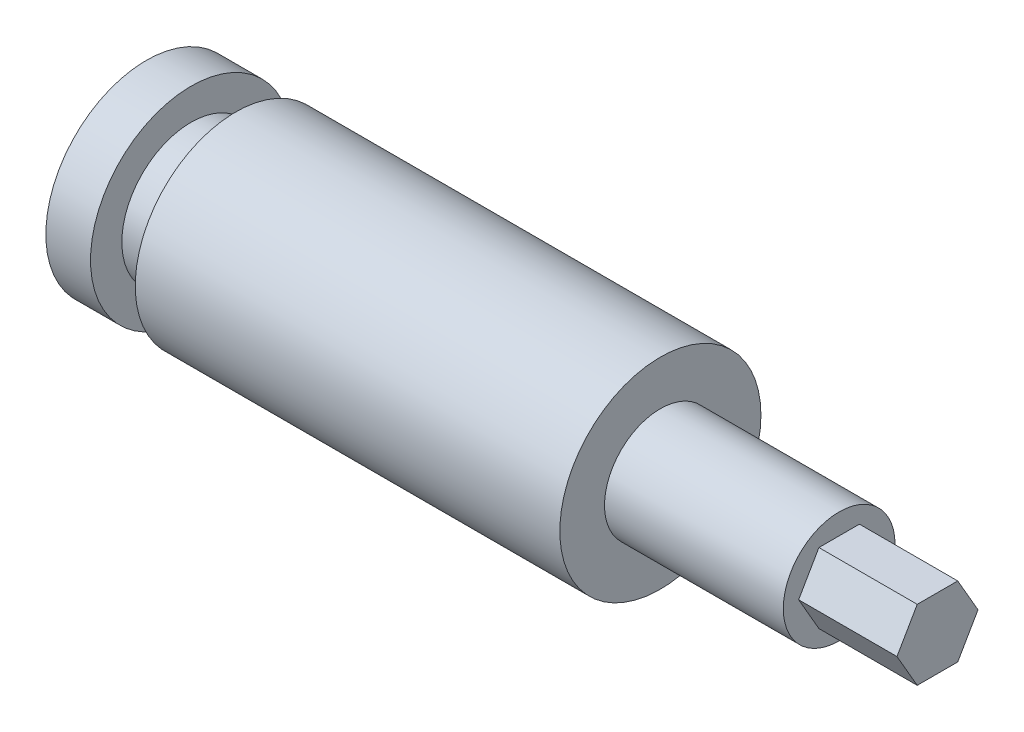
ISO-10303-21;
HEADER;
FILE_DESCRIPTION(('STEP AP214'),'2;1');
FILE_NAME('part.step','',(''),(''),'','','');
FILE_SCHEMA(('AUTOMOTIVE_DESIGN { 1 0 10303 214 1 1 1 1 }'));
ENDSEC;
DATA;
#1=APPLICATION_CONTEXT('core data for automotive mechanical design processes');
#2=APPLICATION_PROTOCOL_DEFINITION('international standard','automotive_design',2000,#1);
#3=PRODUCT_CONTEXT('',#1,'mechanical');
#4=PRODUCT('Part','Part','',(#3));
#5=PRODUCT_RELATED_PRODUCT_CATEGORY('part','',(#4));
#6=PRODUCT_DEFINITION_FORMATION('','',#4);
#7=PRODUCT_DEFINITION_CONTEXT('part definition',#1,'design');
#8=PRODUCT_DEFINITION('design','',#6,#7);
#9=PRODUCT_DEFINITION_SHAPE('','',#8);
#10=(LENGTH_UNIT() NAMED_UNIT(*) SI_UNIT(.MILLI.,.METRE.));
#11=(NAMED_UNIT(*) PLANE_ANGLE_UNIT() SI_UNIT($,.RADIAN.));
#12=(NAMED_UNIT(*) SI_UNIT($,.STERADIAN.) SOLID_ANGLE_UNIT());
#13=UNCERTAINTY_MEASURE_WITH_UNIT(LENGTH_MEASURE(1.E-05),#10,'distance_accuracy_value','');
#14=(GEOMETRIC_REPRESENTATION_CONTEXT(3) GLOBAL_UNCERTAINTY_ASSIGNED_CONTEXT((#13)) GLOBAL_UNIT_ASSIGNED_CONTEXT((#10,
#11,#12)) REPRESENTATION_CONTEXT('',''));
#15=CARTESIAN_POINT('',(0.,0.,0.));
#16=DIRECTION('',(0.,0.,1.));
#17=DIRECTION('',(1.,0.,0.));
#18=AXIS2_PLACEMENT_3D('',#15,#16,#17);
#19=CARTESIAN_POINT('',(0.,0.,0.));
#20=DIRECTION('',(-1.,0.,0.));
#21=DIRECTION('',(0.,0.,1.));
#22=AXIS2_PLACEMENT_3D('',#19,#20,#21);
#23=PLANE('',#22);
#24=CARTESIAN_POINT('',(0.,0.,0.));
#25=DIRECTION('',(-1.,0.,0.));
#26=DIRECTION('',(0.,0.,1.));
#27=AXIS2_PLACEMENT_3D('',#24,#25,#26);
#28=CIRCLE('',#27,1.6);
#29=CARTESIAN_POINT('',(0.,0.,1.6));
#30=VERTEX_POINT('',#29);
#31=EDGE_CURVE('E124',#30,#30,#28,.T.);
#32=ORIENTED_EDGE('',*,*,#31,.F.);
#33=EDGE_LOOP('',(#32));
#34=FACE_BOUND('',#33,.T.);
#35=CARTESIAN_POINT('',(0.,0.,0.));
#36=DIRECTION('',(1.,0.,0.));
#37=DIRECTION('',(0.,0.,-1.));
#38=AXIS2_PLACEMENT_3D('',#35,#36,#37);
#39=CIRCLE('',#38,4.5);
#40=CARTESIAN_POINT('',(0.,0.,-4.5));
#41=VERTEX_POINT('',#40);
#42=EDGE_CURVE('E181',#41,#41,#39,.T.);
#43=ORIENTED_EDGE('',*,*,#42,.F.);
#44=EDGE_LOOP('',(#43));
#45=FACE_BOUND('',#44,.T.);
#46=ADVANCED_FACE('F55',(#34,#45),#23,.T.);
#47=CARTESIAN_POINT('',(0.,0.,0.));
#48=DIRECTION('',(1.,0.,0.));
#49=DIRECTION('',(0.,0.,-1.));
#50=AXIS2_PLACEMENT_3D('',#47,#48,#49);
#51=CYLINDRICAL_SURFACE('',#50,4.5);
#52=ORIENTED_EDGE('',*,*,#42,.T.);
#53=EDGE_LOOP('',(#52));
#54=FACE_BOUND('',#53,.T.);
#55=CARTESIAN_POINT('',(2.,0.,0.));
#56=DIRECTION('',(1.,0.,0.));
#57=DIRECTION('',(0.,0.,-1.));
#58=AXIS2_PLACEMENT_3D('',#55,#56,#57);
#59=CIRCLE('',#58,4.5);
#60=CARTESIAN_POINT('',(2.,0.,-4.5));
#61=VERTEX_POINT('',#60);
#62=EDGE_CURVE('E178',#61,#61,#59,.T.);
#63=ORIENTED_EDGE('',*,*,#62,.F.);
#64=EDGE_LOOP('',(#63));
#65=FACE_BOUND('',#64,.T.);
#66=ADVANCED_FACE('F219',(#54,#65),#51,.T.);
#67=CARTESIAN_POINT('',(2.,4.5,0.));
#68=DIRECTION('',(1.,0.,0.));
#69=DIRECTION('',(0.,0.,-1.));
#70=AXIS2_PLACEMENT_3D('',#67,#68,#69);
#71=PLANE('',#70);
#72=ORIENTED_EDGE('',*,*,#62,.T.);
#73=EDGE_LOOP('',(#72));
#74=FACE_BOUND('',#73,.T.);
#75=CARTESIAN_POINT('',(2.,0.,0.));
#76=DIRECTION('',(1.,0.,0.));
#77=DIRECTION('',(0.,0.,-1.));
#78=AXIS2_PLACEMENT_3D('',#75,#76,#77);
#79=CIRCLE('',#78,3.1);
#80=CARTESIAN_POINT('',(2.,0.,-3.1));
#81=VERTEX_POINT('',#80);
#82=EDGE_CURVE('E175',#81,#81,#79,.T.);
#83=ORIENTED_EDGE('',*,*,#82,.F.);
#84=EDGE_LOOP('',(#83));
#85=FACE_BOUND('',#84,.T.);
#86=ADVANCED_FACE('F224',(#74,#85),#71,.T.);
#87=CARTESIAN_POINT('',(0.,0.,0.));
#88=DIRECTION('',(1.,0.,0.));
#89=DIRECTION('',(0.,0.,-1.));
#90=AXIS2_PLACEMENT_3D('',#87,#88,#89);
#91=CYLINDRICAL_SURFACE('',#90,3.1);
#92=ORIENTED_EDGE('',*,*,#82,.T.);
#93=EDGE_LOOP('',(#92));
#94=FACE_BOUND('',#93,.T.);
#95=CARTESIAN_POINT('',(4.,0.,0.));
#96=DIRECTION('',(1.,0.,0.));
#97=DIRECTION('',(0.,0.,-1.));
#98=AXIS2_PLACEMENT_3D('',#95,#96,#97);
#99=CIRCLE('',#98,3.1);
#100=CARTESIAN_POINT('',(4.,0.,-3.1));
#101=VERTEX_POINT('',#100);
#102=EDGE_CURVE('E172',#101,#101,#99,.T.);
#103=ORIENTED_EDGE('',*,*,#102,.F.);
#104=EDGE_LOOP('',(#103));
#105=FACE_BOUND('',#104,.T.);
#106=ADVANCED_FACE('F235',(#94,#105),#91,.T.);
#107=CARTESIAN_POINT('',(4.,3.1,0.));
#108=DIRECTION('',(-1.,0.,0.));
#109=DIRECTION('',(0.,0.,1.));
#110=AXIS2_PLACEMENT_3D('',#107,#108,#109);
#111=PLANE('',#110);
#112=ORIENTED_EDGE('',*,*,#102,.T.);
#113=EDGE_LOOP('',(#112));
#114=FACE_BOUND('',#113,.T.);
#115=CARTESIAN_POINT('',(4.,0.,0.));
#116=DIRECTION('',(1.,0.,0.));
#117=DIRECTION('',(0.,0.,-1.));
#118=AXIS2_PLACEMENT_3D('',#115,#116,#117);
#119=CIRCLE('',#118,4.5);
#120=CARTESIAN_POINT('',(4.,0.,-4.5));
#121=VERTEX_POINT('',#120);
#122=EDGE_CURVE('E169',#121,#121,#119,.T.);
#123=ORIENTED_EDGE('',*,*,#122,.F.);
#124=EDGE_LOOP('',(#123));
#125=FACE_BOUND('',#124,.T.);
#126=ADVANCED_FACE('F241',(#114,#125),#111,.T.);
#127=CARTESIAN_POINT('',(0.,0.,0.));
#128=DIRECTION('',(1.,0.,0.));
#129=DIRECTION('',(0.,0.,-1.));
#130=AXIS2_PLACEMENT_3D('',#127,#128,#129);
#131=CYLINDRICAL_SURFACE('',#130,4.5);
#132=ORIENTED_EDGE('',*,*,#122,.T.);
#133=EDGE_LOOP('',(#132));
#134=FACE_BOUND('',#133,.T.);
#135=CARTESIAN_POINT('',(23.,0.,0.));
#136=DIRECTION('',(1.,0.,0.));
#137=DIRECTION('',(0.,0.,-1.));
#138=AXIS2_PLACEMENT_3D('',#135,#136,#137);
#139=CIRCLE('',#138,4.5);
#140=CARTESIAN_POINT('',(23.,0.,-4.5));
#141=VERTEX_POINT('',#140);
#142=EDGE_CURVE('E166',#141,#141,#139,.T.);
#143=ORIENTED_EDGE('',*,*,#142,.F.);
#144=EDGE_LOOP('',(#143));
#145=FACE_BOUND('',#144,.T.);
#146=ADVANCED_FACE('F247',(#134,#145),#131,.T.);
#147=CARTESIAN_POINT('',(23.,4.5,0.));
#148=DIRECTION('',(1.,0.,0.));
#149=DIRECTION('',(0.,0.,-1.));
#150=AXIS2_PLACEMENT_3D('',#147,#148,#149);
#151=PLANE('',#150);
#152=ORIENTED_EDGE('',*,*,#142,.T.);
#153=EDGE_LOOP('',(#152));
#154=FACE_BOUND('',#153,.T.);
#155=CARTESIAN_POINT('',(23.,0.,0.));
#156=DIRECTION('',(1.,0.,0.));
#157=DIRECTION('',(0.,0.,-1.));
#158=AXIS2_PLACEMENT_3D('',#155,#156,#157);
#159=CIRCLE('',#158,2.5);
#160=CARTESIAN_POINT('',(23.,0.,-2.5));
#161=VERTEX_POINT('',#160);
#162=EDGE_CURVE('E163',#161,#161,#159,.T.);
#163=ORIENTED_EDGE('',*,*,#162,.F.);
#164=EDGE_LOOP('',(#163));
#165=FACE_BOUND('',#164,.T.);
#166=ADVANCED_FACE('F253',(#154,#165),#151,.T.);
#167=CARTESIAN_POINT('',(0.,0.,0.));
#168=DIRECTION('',(1.,0.,0.));
#169=DIRECTION('',(0.,0.,-1.));
#170=AXIS2_PLACEMENT_3D('',#167,#168,#169);
#171=CYLINDRICAL_SURFACE('',#170,2.5);
#172=CARTESIAN_POINT('',(31.,0.,0.));
#173=DIRECTION('',(-1.,0.,0.));
#174=DIRECTION('',(0.,0.,1.));
#175=AXIS2_PLACEMENT_3D('',#172,#173,#174);
#176=CIRCLE('',#175,2.5);
#177=CARTESIAN_POINT('',(31.,0.,2.5));
#178=VERTEX_POINT('',#177);
#179=EDGE_CURVE('E13',#178,#178,#176,.F.);
#180=ORIENTED_EDGE('',*,*,#179,.F.);
#181=EDGE_LOOP('',(#180));
#182=FACE_BOUND('',#181,.T.);
#183=ORIENTED_EDGE('',*,*,#162,.T.);
#184=EDGE_LOOP('',(#183));
#185=FACE_BOUND('',#184,.T.);
#186=ADVANCED_FACE('F259',(#182,#185),#171,.T.);
#187=CARTESIAN_POINT('',(35.4,2.5,0.));
#188=DIRECTION('',(1.,0.,0.));
#189=DIRECTION('',(0.,0.,-1.));
#190=AXIS2_PLACEMENT_3D('',#187,#188,#189);
#191=PLANE('',#190);
#192=DIRECTION('',(0.,0.86602540378444,-0.499999999999998));
#193=VECTOR('',#192,1.);
#194=CARTESIAN_POINT('',(35.4,0.784999999999999,1.35965988394157));
#195=LINE('',#194,#193);
#196=CARTESIAN_POINT('',(35.4,0.,1.81287984525543));
#197=VERTEX_POINT('',#196);
#198=CARTESIAN_POINT('',(35.4,1.57,0.906439922627717));
#199=VERTEX_POINT('',#198);
#200=EDGE_CURVE('E77',#197,#199,#195,.T.);
#201=ORIENTED_EDGE('',*,*,#200,.F.);
#202=DIRECTION('',(0.,0.866025403784436,0.500000000000004));
#203=VECTOR('',#202,1.);
#204=CARTESIAN_POINT('',(35.4,-0.785000000000009,1.35965988394157));
#205=LINE('',#204,#203);
#206=CARTESIAN_POINT('',(35.4,-1.57,0.90643992262771));
#207=VERTEX_POINT('',#206);
#208=EDGE_CURVE('E148',#207,#197,#205,.T.);
#209=ORIENTED_EDGE('',*,*,#208,.F.);
#210=DIRECTION('',(0.,0.,1.));
#211=VECTOR('',#210,1.);
#212=CARTESIAN_POINT('',(35.4,-1.57,0.));
#213=LINE('',#212,#211);
#214=CARTESIAN_POINT('',(35.4,-1.57,-0.906439922627725));
#215=VERTEX_POINT('',#214);
#216=EDGE_CURVE('E141',#215,#207,#213,.T.);
#217=ORIENTED_EDGE('',*,*,#216,.F.);
#218=DIRECTION('',(0.,-0.866025403784443,0.499999999999992));
#219=VECTOR('',#218,1.);
#220=CARTESIAN_POINT('',(35.4,-0.784999999999989,-1.35965988394158));
#221=LINE('',#220,#219);
#222=CARTESIAN_POINT('',(35.4,0.,-1.81287984525543));
#223=VERTEX_POINT('',#222);
#224=EDGE_CURVE('E134',#223,#215,#221,.T.);
#225=ORIENTED_EDGE('',*,*,#224,.F.);
#226=DIRECTION('',(0.,-0.866025403784433,-0.50000000000001));
#227=VECTOR('',#226,1.);
#228=CARTESIAN_POINT('',(35.4,0.785000000000018,-1.35965988394156));
#229=LINE('',#228,#227);
#230=CARTESIAN_POINT('',(35.4,1.57,-0.906439922627703));
#231=VERTEX_POINT('',#230);
#232=EDGE_CURVE('E121',#231,#223,#229,.T.);
#233=ORIENTED_EDGE('',*,*,#232,.F.);
#234=DIRECTION('',(0.,0.,-1.));
#235=VECTOR('',#234,1.);
#236=CARTESIAN_POINT('',(35.4,1.57,0.));
#237=LINE('',#236,#235);
#238=EDGE_CURVE('E62',#199,#231,#237,.T.);
#239=ORIENTED_EDGE('',*,*,#238,.F.);
#240=EDGE_LOOP('',(#201,#209,#217,#225,#233,#239));
#241=FACE_BOUND('',#240,.T.);
#242=ADVANCED_FACE('F190',(#241),#191,.T.);
#243=CARTESIAN_POINT('',(31.,1.57,-4.5));
#244=DIRECTION('',(0.,-1.,0.));
#245=DIRECTION('',(0.,0.,-1.));
#246=AXIS2_PLACEMENT_3D('',#243,#244,#245);
#247=PLANE('',#246);
#248=DIRECTION('',(0.,0.,1.));
#249=VECTOR('',#248,1.);
#250=CARTESIAN_POINT('',(31.,1.57,-4.5));
#251=LINE('',#250,#249);
#252=CARTESIAN_POINT('',(31.,1.57,-0.906439922627703));
#253=VERTEX_POINT('',#252);
#254=CARTESIAN_POINT('',(31.,1.57,0.906439922627718));
#255=VERTEX_POINT('',#254);
#256=EDGE_CURVE('E160',#253,#255,#251,.T.);
#257=ORIENTED_EDGE('',*,*,#256,.T.);
#258=DIRECTION('',(1.,0.,0.));
#259=VECTOR('',#258,1.);
#260=CARTESIAN_POINT('',(31.,1.57,0.906439922627717));
#261=LINE('',#260,#259);
#262=EDGE_CURVE('E158',#255,#199,#261,.T.);
#263=ORIENTED_EDGE('',*,*,#262,.T.);
#264=ORIENTED_EDGE('',*,*,#238,.T.);
#265=DIRECTION('',(-1.,0.,0.));
#266=VECTOR('',#265,1.);
#267=CARTESIAN_POINT('',(31.,1.57,-0.906439922627703));
#268=LINE('',#267,#266);
#269=EDGE_CURVE('E156',#231,#253,#268,.T.);
#270=ORIENTED_EDGE('',*,*,#269,.T.);
#271=EDGE_LOOP('',(#257,#263,#264,#270));
#272=FACE_BOUND('',#271,.T.);
#273=ADVANCED_FACE('F186',(#272),#247,.F.);
#274=CARTESIAN_POINT('',(31.,2.5,-4.5));
#275=DIRECTION('',(-1.,0.,0.));
#276=DIRECTION('',(0.,0.,1.));
#277=AXIS2_PLACEMENT_3D('',#274,#275,#276);
#278=PLANE('',#277);
#279=ORIENTED_EDGE('',*,*,#179,.T.);
#280=EDGE_LOOP('',(#279));
#281=FACE_BOUND('',#280,.T.);
#282=DIRECTION('',(0.,-0.86602540378444,0.499999999999998));
#283=VECTOR('',#282,1.);
#284=CARTESIAN_POINT('',(31.,4.68211431702998,-0.890340116058417));
#285=LINE('',#284,#283);
#286=CARTESIAN_POINT('',(31.,0.,1.81287984525543));
#287=VERTEX_POINT('',#286);
#288=EDGE_CURVE('E153',#255,#287,#285,.T.);
#289=ORIENTED_EDGE('',*,*,#288,.F.);
#290=ORIENTED_EDGE('',*,*,#256,.F.);
#291=DIRECTION('',(0.,0.866025403784433,0.50000000000001));
#292=VECTOR('',#291,1.);
#293=CARTESIAN_POINT('',(31.,-3.11211431702993,-3.60965988394161));
#294=LINE('',#293,#292);
#295=CARTESIAN_POINT('',(31.,0.,-1.81287984525543));
#296=VERTEX_POINT('',#295);
#297=EDGE_CURVE('E69',#296,#253,#294,.T.);
#298=ORIENTED_EDGE('',*,*,#297,.F.);
#299=DIRECTION('',(0.,0.866025403784443,-0.499999999999992));
#300=VECTOR('',#299,1.);
#301=CARTESIAN_POINT('',(31.,-4.68211431702998,0.890340116058384));
#302=LINE('',#301,#300);
#303=CARTESIAN_POINT('',(31.,-1.57,-0.906439922627726));
#304=VERTEX_POINT('',#303);
#305=EDGE_CURVE('E132',#304,#296,#302,.T.);
#306=ORIENTED_EDGE('',*,*,#305,.F.);
#307=DIRECTION('',(0.,0.,-1.));
#308=VECTOR('',#307,1.);
#309=CARTESIAN_POINT('',(31.,-1.57,4.5));
#310=LINE('',#309,#308);
#311=CARTESIAN_POINT('',(31.,-1.57,0.90643992262771));
#312=VERTEX_POINT('',#311);
#313=EDGE_CURVE('E139',#312,#304,#310,.T.);
#314=ORIENTED_EDGE('',*,*,#313,.F.);
#315=DIRECTION('',(0.,-0.866025403784436,-0.500000000000004));
#316=VECTOR('',#315,1.);
#317=CARTESIAN_POINT('',(31.,3.11211431702996,3.60965988394159));
#318=LINE('',#317,#316);
#319=EDGE_CURVE('E146',#287,#312,#318,.T.);
#320=ORIENTED_EDGE('',*,*,#319,.F.);
#321=EDGE_LOOP('',(#289,#290,#298,#306,#314,#320));
#322=FACE_BOUND('',#321,.T.);
#323=ADVANCED_FACE('F201',(#281,#322),#278,.F.);
#324=CARTESIAN_POINT('',(31.,4.68211431702998,-0.890340116058417));
#325=DIRECTION('',(0.,-0.499999999999998,-0.86602540378444));
#326=DIRECTION('',(0.,0.86602540378444,-0.499999999999998));
#327=AXIS2_PLACEMENT_3D('',#324,#325,#326);
#328=PLANE('',#327);
#329=ORIENTED_EDGE('',*,*,#288,.T.);
#330=DIRECTION('',(1.,0.,0.));
#331=VECTOR('',#330,1.);
#332=CARTESIAN_POINT('',(31.,0.,1.81287984525543));
#333=LINE('',#332,#331);
#334=EDGE_CURVE('E151',#287,#197,#333,.T.);
#335=ORIENTED_EDGE('',*,*,#334,.T.);
#336=ORIENTED_EDGE('',*,*,#200,.T.);
#337=ORIENTED_EDGE('',*,*,#262,.F.);
#338=EDGE_LOOP('',(#329,#335,#336,#337));
#339=FACE_BOUND('',#338,.T.);
#340=ADVANCED_FACE('F204',(#339),#328,.F.);
#341=CARTESIAN_POINT('',(31.,-3.11211431702993,-3.60965988394161));
#342=DIRECTION('',(0.,-0.50000000000001,0.866025403784433));
#343=DIRECTION('',(0.,-0.866025403784433,-0.50000000000001));
#344=AXIS2_PLACEMENT_3D('',#341,#342,#343);
#345=PLANE('',#344);
#346=ORIENTED_EDGE('',*,*,#232,.T.);
#347=DIRECTION('',(1.,0.,0.));
#348=VECTOR('',#347,1.);
#349=CARTESIAN_POINT('',(31.,0.,-1.81287984525543));
#350=LINE('',#349,#348);
#351=EDGE_CURVE('E129',#296,#223,#350,.T.);
#352=ORIENTED_EDGE('',*,*,#351,.F.);
#353=ORIENTED_EDGE('',*,*,#297,.T.);
#354=ORIENTED_EDGE('',*,*,#269,.F.);
#355=EDGE_LOOP('',(#346,#352,#353,#354));
#356=FACE_BOUND('',#355,.T.);
#357=ADVANCED_FACE('F194',(#356),#345,.F.);
#358=CARTESIAN_POINT('',(31.,3.11211431702996,3.60965988394159));
#359=DIRECTION('',(0.,0.500000000000004,-0.866025403784436));
#360=DIRECTION('',(0.,0.866025403784436,0.500000000000004));
#361=AXIS2_PLACEMENT_3D('',#358,#359,#360);
#362=PLANE('',#361);
#363=ORIENTED_EDGE('',*,*,#319,.T.);
#364=DIRECTION('',(1.,0.,0.));
#365=VECTOR('',#364,1.);
#366=CARTESIAN_POINT('',(31.,-1.57,0.90643992262771));
#367=LINE('',#366,#365);
#368=EDGE_CURVE('E144',#312,#207,#367,.T.);
#369=ORIENTED_EDGE('',*,*,#368,.T.);
#370=ORIENTED_EDGE('',*,*,#208,.T.);
#371=ORIENTED_EDGE('',*,*,#334,.F.);
#372=EDGE_LOOP('',(#363,#369,#370,#371));
#373=FACE_BOUND('',#372,.T.);
#374=ADVANCED_FACE('F206',(#373),#362,.F.);
#375=CARTESIAN_POINT('',(31.,-1.57,4.5));
#376=DIRECTION('',(0.,1.,0.));
#377=DIRECTION('',(0.,0.,1.));
#378=AXIS2_PLACEMENT_3D('',#375,#376,#377);
#379=PLANE('',#378);
#380=ORIENTED_EDGE('',*,*,#313,.T.);
#381=DIRECTION('',(1.,0.,0.));
#382=VECTOR('',#381,1.);
#383=CARTESIAN_POINT('',(31.,-1.57,-0.906439922627725));
#384=LINE('',#383,#382);
#385=EDGE_CURVE('E137',#304,#215,#384,.T.);
#386=ORIENTED_EDGE('',*,*,#385,.T.);
#387=ORIENTED_EDGE('',*,*,#216,.T.);
#388=ORIENTED_EDGE('',*,*,#368,.F.);
#389=EDGE_LOOP('',(#380,#386,#387,#388));
#390=FACE_BOUND('',#389,.T.);
#391=ADVANCED_FACE('F209',(#390),#379,.F.);
#392=CARTESIAN_POINT('',(31.,-4.68211431702998,0.890340116058384));
#393=DIRECTION('',(0.,0.499999999999992,0.866025403784443));
#394=DIRECTION('',(0.,-0.866025403784443,0.499999999999992));
#395=AXIS2_PLACEMENT_3D('',#392,#393,#394);
#396=PLANE('',#395);
#397=ORIENTED_EDGE('',*,*,#305,.T.);
#398=ORIENTED_EDGE('',*,*,#351,.T.);
#399=ORIENTED_EDGE('',*,*,#224,.T.);
#400=ORIENTED_EDGE('',*,*,#385,.F.);
#401=EDGE_LOOP('',(#397,#398,#399,#400));
#402=FACE_BOUND('',#401,.T.);
#403=ADVANCED_FACE('F113',(#402),#396,.F.);
#404=CARTESIAN_POINT('',(8.5,0.,0.));
#405=DIRECTION('',(-1.,0.,0.));
#406=DIRECTION('',(0.,0.,1.));
#407=AXIS2_PLACEMENT_3D('',#404,#405,#406);
#408=CONICAL_SURFACE('',#407,1.25,1.02974425867665);
#409=CARTESIAN_POINT('',(9.25107577378445,0.,0.));
#410=VERTEX_POINT('',#409);
#411=VERTEX_LOOP('',#410);
#412=FACE_BOUND('',#411,.T.);
#413=CARTESIAN_POINT('',(8.5,0.,0.));
#414=DIRECTION('',(-1.,0.,0.));
#415=DIRECTION('',(0.,0.,1.));
#416=AXIS2_PLACEMENT_3D('',#413,#414,#415);
#417=CIRCLE('',#416,1.25);
#418=CARTESIAN_POINT('',(8.5,0.,1.25));
#419=VERTEX_POINT('',#418);
#420=EDGE_CURVE('E117',#419,#419,#417,.T.);
#421=ORIENTED_EDGE('',*,*,#420,.T.);
#422=EDGE_LOOP('',(#421));
#423=FACE_BOUND('',#422,.T.);
#424=ADVANCED_FACE('F109',(#412,#423),#408,.F.);
#425=CARTESIAN_POINT('',(0.,0.,0.));
#426=DIRECTION('',(-1.,0.,0.));
#427=DIRECTION('',(0.,0.,1.));
#428=AXIS2_PLACEMENT_3D('',#425,#426,#427);
#429=CYLINDRICAL_SURFACE('',#428,1.25);
#430=ORIENTED_EDGE('',*,*,#420,.F.);
#431=EDGE_LOOP('',(#430));
#432=FACE_BOUND('',#431,.T.);
#433=CARTESIAN_POINT('',(0.350000000000001,0.,0.));
#434=DIRECTION('',(-1.,0.,0.));
#435=DIRECTION('',(0.,0.,1.));
#436=AXIS2_PLACEMENT_3D('',#433,#434,#435);
#437=CIRCLE('',#436,1.25);
#438=CARTESIAN_POINT('',(0.350000000000001,0.,1.25));
#439=VERTEX_POINT('',#438);
#440=EDGE_CURVE('E119',#439,#439,#437,.T.);
#441=ORIENTED_EDGE('',*,*,#440,.T.);
#442=EDGE_LOOP('',(#441));
#443=FACE_BOUND('',#442,.T.);
#444=ADVANCED_FACE('F112',(#432,#443),#429,.F.);
#445=CARTESIAN_POINT('',(0.,0.,0.));
#446=DIRECTION('',(-1.,0.,0.));
#447=DIRECTION('',(0.,0.,1.));
#448=AXIS2_PLACEMENT_3D('',#445,#446,#447);
#449=CONICAL_SURFACE('',#448,1.6,0.785398163397448);
#450=ORIENTED_EDGE('',*,*,#440,.F.);
#451=EDGE_LOOP('',(#450));
#452=FACE_BOUND('',#451,.T.);
#453=ORIENTED_EDGE('',*,*,#31,.T.);
#454=EDGE_LOOP('',(#453));
#455=FACE_BOUND('',#454,.T.);
#456=ADVANCED_FACE('F287',(#452,#455),#449,.F.);
#457=CLOSED_SHELL('',(#46,#66,#86,#106,#126,#146,#166,#186,#242,#273,#323,#340,#357,#374,#391,
#403,#424,#444,#456));
#458=MANIFOLD_SOLID_BREP('B2',#457);
#459=ADVANCED_BREP_SHAPE_REPRESENTATION('',(#18,#458),#14);
#460=SHAPE_DEFINITION_REPRESENTATION(#9,#459);
ENDSEC;
END-ISO-10303-21;
